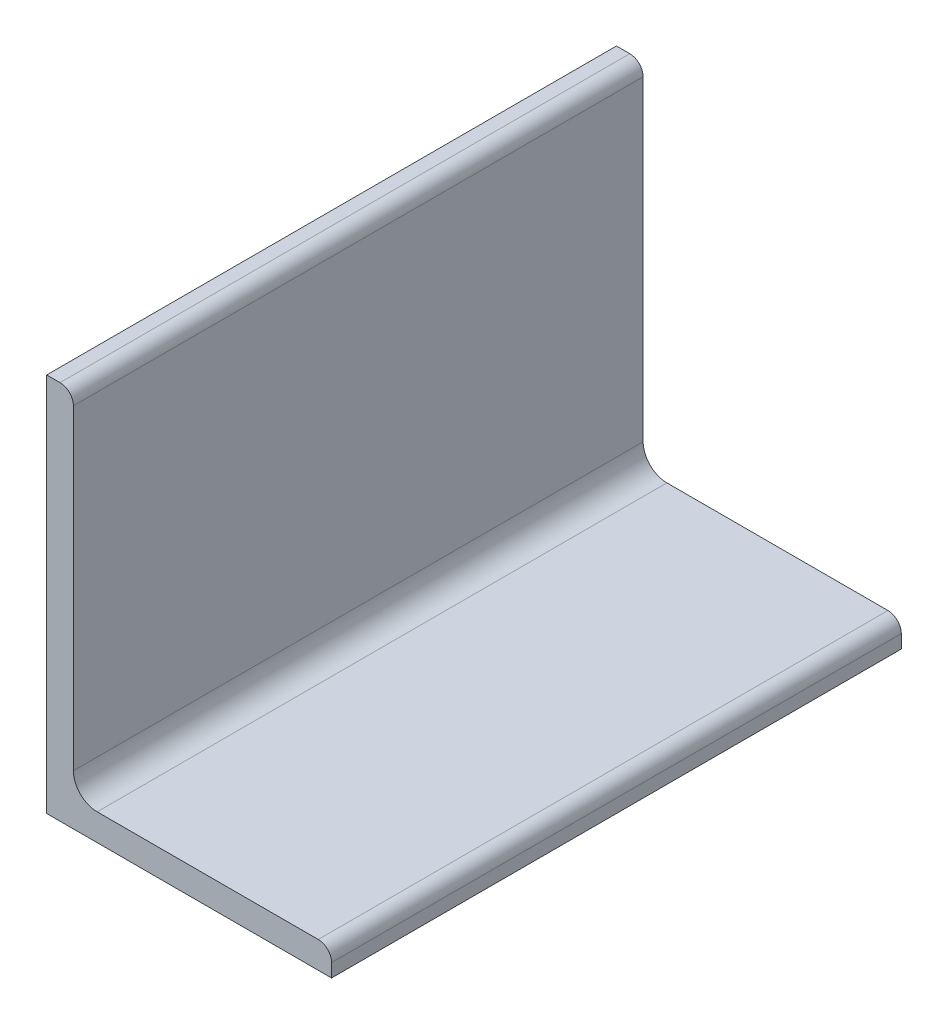
ISO-10303-21;
HEADER;
FILE_DESCRIPTION(('STEP AP214'),'2;1');
FILE_NAME('part.step','',(''),(''),'','','');
FILE_SCHEMA(('AUTOMOTIVE_DESIGN { 1 0 10303 214 1 1 1 1 }'));
ENDSEC;
DATA;
#1=APPLICATION_CONTEXT('core data for automotive mechanical design processes');
#2=APPLICATION_PROTOCOL_DEFINITION('international standard','automotive_design',2000,#1);
#3=PRODUCT_CONTEXT('',#1,'mechanical');
#4=PRODUCT('Part','Part','',(#3));
#5=PRODUCT_RELATED_PRODUCT_CATEGORY('part','',(#4));
#6=PRODUCT_DEFINITION_FORMATION('','',#4);
#7=PRODUCT_DEFINITION_CONTEXT('part definition',#1,'design');
#8=PRODUCT_DEFINITION('design','',#6,#7);
#9=PRODUCT_DEFINITION_SHAPE('','',#8);
#10=(LENGTH_UNIT() NAMED_UNIT(*) SI_UNIT(.MILLI.,.METRE.));
#11=(NAMED_UNIT(*) PLANE_ANGLE_UNIT() SI_UNIT($,.RADIAN.));
#12=(NAMED_UNIT(*) SI_UNIT($,.STERADIAN.) SOLID_ANGLE_UNIT());
#13=UNCERTAINTY_MEASURE_WITH_UNIT(LENGTH_MEASURE(1.E-05),#10,'distance_accuracy_value','');
#14=(GEOMETRIC_REPRESENTATION_CONTEXT(3) GLOBAL_UNCERTAINTY_ASSIGNED_CONTEXT((#13)) GLOBAL_UNIT_ASSIGNED_CONTEXT((#10,
#11,#12)) REPRESENTATION_CONTEXT('',''));
#15=CARTESIAN_POINT('',(0.,0.,0.));
#16=DIRECTION('',(0.,0.,1.));
#17=DIRECTION('',(1.,0.,0.));
#18=AXIS2_PLACEMENT_3D('',#15,#16,#17);
#19=CARTESIAN_POINT('',(0.425014111727251,203.678837479771,304.8));
#20=DIRECTION('',(1.,0.,0.));
#21=DIRECTION('',(0.,0.,-1.));
#22=AXIS2_PLACEMENT_3D('',#19,#20,#21);
#23=PLANE('',#22);
#24=DIRECTION('',(0.,-1.,0.));
#25=VECTOR('',#24,1.);
#26=CARTESIAN_POINT('',(0.425014111727251,203.678837479771,0.));
#27=LINE('',#26,#25);
#28=CARTESIAN_POINT('',(0.425014111727251,203.678837479771,0.));
#29=VERTEX_POINT('',#28);
#30=CARTESIAN_POINT('',(0.425014111727251,0.478837479771347,0.));
#31=VERTEX_POINT('',#30);
#32=EDGE_CURVE('E135',#29,#31,#27,.T.);
#33=ORIENTED_EDGE('',*,*,#32,.T.);
#34=DIRECTION('',(0.,0.,-1.));
#35=VECTOR('',#34,1.);
#36=CARTESIAN_POINT('',(0.425014111727251,0.478837479771347,304.8));
#37=LINE('',#36,#35);
#38=CARTESIAN_POINT('',(0.425014111727251,0.478837479771347,304.8));
#39=VERTEX_POINT('',#38);
#40=EDGE_CURVE('E11',#39,#31,#37,.T.);
#41=ORIENTED_EDGE('',*,*,#40,.F.);
#42=DIRECTION('',(0.,-1.,0.));
#43=VECTOR('',#42,1.);
#44=CARTESIAN_POINT('',(0.425014111727251,203.678837479771,304.8));
#45=LINE('',#44,#43);
#46=CARTESIAN_POINT('',(0.425014111727251,203.678837479771,304.8));
#47=VERTEX_POINT('',#46);
#48=EDGE_CURVE('E151',#47,#39,#45,.T.);
#49=ORIENTED_EDGE('',*,*,#48,.F.);
#50=DIRECTION('',(0.,0.,-1.));
#51=VECTOR('',#50,1.);
#52=CARTESIAN_POINT('',(0.425014111727251,203.678837479771,304.8));
#53=LINE('',#52,#51);
#54=EDGE_CURVE('E131',#47,#29,#53,.T.);
#55=ORIENTED_EDGE('',*,*,#54,.T.);
#56=EDGE_LOOP('',(#33,#41,#49,#55));
#57=FACE_BOUND('',#56,.T.);
#58=ADVANCED_FACE('F33',(#57),#23,.F.);
#59=CARTESIAN_POINT('',(0.425014111727251,0.478837479771347,304.8));
#60=DIRECTION('',(0.,1.,0.));
#61=DIRECTION('',(0.,0.,1.));
#62=AXIS2_PLACEMENT_3D('',#59,#60,#61);
#63=PLANE('',#62);
#64=DIRECTION('',(1.,0.,0.));
#65=VECTOR('',#64,1.);
#66=CARTESIAN_POINT('',(0.425014111727251,0.478837479771347,0.));
#67=LINE('',#66,#65);
#68=CARTESIAN_POINT('',(152.825014111727,0.478837479771347,0.));
#69=VERTEX_POINT('',#68);
#70=EDGE_CURVE('E138',#31,#69,#67,.T.);
#71=ORIENTED_EDGE('',*,*,#70,.T.);
#72=DIRECTION('',(0.,0.,-1.));
#73=VECTOR('',#72,1.);
#74=CARTESIAN_POINT('',(152.825014111727,0.478837479771347,304.8));
#75=LINE('',#74,#73);
#76=CARTESIAN_POINT('',(152.825014111727,0.478837479771347,304.8));
#77=VERTEX_POINT('',#76);
#78=EDGE_CURVE('E41',#77,#69,#75,.T.);
#79=ORIENTED_EDGE('',*,*,#78,.F.);
#80=DIRECTION('',(1.,0.,0.));
#81=VECTOR('',#80,1.);
#82=CARTESIAN_POINT('',(0.425014111727251,0.478837479771347,304.8));
#83=LINE('',#82,#81);
#84=EDGE_CURVE('E95',#39,#77,#83,.T.);
#85=ORIENTED_EDGE('',*,*,#84,.F.);
#86=ORIENTED_EDGE('',*,*,#40,.T.);
#87=EDGE_LOOP('',(#71,#79,#85,#86));
#88=FACE_BOUND('',#87,.T.);
#89=ADVANCED_FACE('F194',(#88),#63,.F.);
#90=CARTESIAN_POINT('',(152.825014111727,0.478837479771347,304.8));
#91=DIRECTION('',(-1.,0.,0.));
#92=DIRECTION('',(0.,0.,1.));
#93=AXIS2_PLACEMENT_3D('',#90,#91,#92);
#94=PLANE('',#93);
#95=DIRECTION('',(0.,1.,0.));
#96=VECTOR('',#95,1.);
#97=CARTESIAN_POINT('',(152.825014111727,0.478837479771347,0.));
#98=LINE('',#97,#96);
#99=CARTESIAN_POINT('',(152.825014111727,7.62258747977135,0.));
#100=VERTEX_POINT('',#99);
#101=EDGE_CURVE('E140',#69,#100,#98,.T.);
#102=ORIENTED_EDGE('',*,*,#101,.T.);
#103=DIRECTION('',(0.,0.,-1.));
#104=VECTOR('',#103,1.);
#105=CARTESIAN_POINT('',(152.825014111727,7.62258747977135,304.8));
#106=LINE('',#105,#104);
#107=CARTESIAN_POINT('',(152.825014111727,7.62258747977135,304.8));
#108=VERTEX_POINT('',#107);
#109=EDGE_CURVE('E161',#108,#100,#106,.T.);
#110=ORIENTED_EDGE('',*,*,#109,.F.);
#111=DIRECTION('',(0.,1.,0.));
#112=VECTOR('',#111,1.);
#113=CARTESIAN_POINT('',(152.825014111727,0.478837479771347,304.8));
#114=LINE('',#113,#112);
#115=EDGE_CURVE('E169',#77,#108,#114,.T.);
#116=ORIENTED_EDGE('',*,*,#115,.F.);
#117=ORIENTED_EDGE('',*,*,#78,.T.);
#118=EDGE_LOOP('',(#102,#110,#116,#117));
#119=FACE_BOUND('',#118,.T.);
#120=ADVANCED_FACE('F167',(#119),#94,.F.);
#121=CARTESIAN_POINT('',(145.681264111727,7.62258747977135,304.8));
#122=DIRECTION('',(0.,0.,-1.));
#123=DIRECTION('',(-1.,0.,0.));
#124=AXIS2_PLACEMENT_3D('',#121,#122,#123);
#125=CYLINDRICAL_SURFACE('',#124,7.14375);
#126=CARTESIAN_POINT('',(145.681264111727,7.62258747977135,0.));
#127=DIRECTION('',(0.,0.,1.));
#128=DIRECTION('',(1.,0.,0.));
#129=AXIS2_PLACEMENT_3D('',#126,#127,#128);
#130=CIRCLE('',#129,7.14375);
#131=CARTESIAN_POINT('',(145.681264111727,14.7663374797713,0.));
#132=VERTEX_POINT('',#131);
#133=EDGE_CURVE('E142',#100,#132,#130,.T.);
#134=ORIENTED_EDGE('',*,*,#133,.T.);
#135=DIRECTION('',(0.,0.,-1.));
#136=VECTOR('',#135,1.);
#137=CARTESIAN_POINT('',(145.681264111727,14.7663374797713,304.8));
#138=LINE('',#137,#136);
#139=CARTESIAN_POINT('',(145.681264111727,14.7663374797713,304.8));
#140=VERTEX_POINT('',#139);
#141=EDGE_CURVE('E158',#140,#132,#138,.T.);
#142=ORIENTED_EDGE('',*,*,#141,.F.);
#143=CARTESIAN_POINT('',(145.681264111727,7.62258747977135,304.8));
#144=DIRECTION('',(0.,0.,1.));
#145=DIRECTION('',(1.,0.,0.));
#146=AXIS2_PLACEMENT_3D('',#143,#144,#145);
#147=CIRCLE('',#146,7.14375);
#148=EDGE_CURVE('E185',#108,#140,#147,.T.);
#149=ORIENTED_EDGE('',*,*,#148,.F.);
#150=ORIENTED_EDGE('',*,*,#109,.T.);
#151=EDGE_LOOP('',(#134,#142,#149,#150));
#152=FACE_BOUND('',#151,.T.);
#153=ADVANCED_FACE('F178',(#152),#125,.T.);
#154=CARTESIAN_POINT('',(145.681264111727,14.7663374797713,304.8));
#155=DIRECTION('',(0.,-1.,0.));
#156=DIRECTION('',(0.,0.,-1.));
#157=AXIS2_PLACEMENT_3D('',#154,#155,#156);
#158=PLANE('',#157);
#159=DIRECTION('',(-1.,0.,0.));
#160=VECTOR('',#159,1.);
#161=CARTESIAN_POINT('',(145.681264111727,14.7663374797713,0.));
#162=LINE('',#161,#160);
#163=CARTESIAN_POINT('',(27.4125141117273,14.7663374797713,0.));
#164=VERTEX_POINT('',#163);
#165=EDGE_CURVE('E144',#132,#164,#162,.T.);
#166=ORIENTED_EDGE('',*,*,#165,.T.);
#167=DIRECTION('',(0.,0.,-1.));
#168=VECTOR('',#167,1.);
#169=CARTESIAN_POINT('',(27.4125141117273,14.7663374797713,304.8));
#170=LINE('',#169,#168);
#171=CARTESIAN_POINT('',(27.4125141117273,14.7663374797713,304.8));
#172=VERTEX_POINT('',#171);
#173=EDGE_CURVE('E155',#172,#164,#170,.T.);
#174=ORIENTED_EDGE('',*,*,#173,.F.);
#175=DIRECTION('',(-1.,0.,0.));
#176=VECTOR('',#175,1.);
#177=CARTESIAN_POINT('',(145.681264111727,14.7663374797713,304.8));
#178=LINE('',#177,#176);
#179=EDGE_CURVE('E184',#140,#172,#178,.T.);
#180=ORIENTED_EDGE('',*,*,#179,.F.);
#181=ORIENTED_EDGE('',*,*,#141,.T.);
#182=EDGE_LOOP('',(#166,#174,#180,#181));
#183=FACE_BOUND('',#182,.T.);
#184=ADVANCED_FACE('F182',(#183),#158,.F.);
#185=CARTESIAN_POINT('',(27.4125141117272,27.4663374797713,304.8));
#186=DIRECTION('',(0.,0.,-1.));
#187=DIRECTION('',(-1.,0.,0.));
#188=AXIS2_PLACEMENT_3D('',#185,#186,#187);
#189=CYLINDRICAL_SURFACE('',#188,12.7);
#190=CARTESIAN_POINT('',(27.4125141117272,27.4663374797713,0.));
#191=DIRECTION('',(0.,0.,-1.));
#192=DIRECTION('',(1.,0.,0.));
#193=AXIS2_PLACEMENT_3D('',#190,#191,#192);
#194=CIRCLE('',#193,12.7);
#195=CARTESIAN_POINT('',(14.7125141117273,27.4663374797713,0.));
#196=VERTEX_POINT('',#195);
#197=EDGE_CURVE('E146',#164,#196,#194,.T.);
#198=ORIENTED_EDGE('',*,*,#197,.T.);
#199=DIRECTION('',(0.,0.,-1.));
#200=VECTOR('',#199,1.);
#201=CARTESIAN_POINT('',(14.7125141117273,27.4663374797713,304.8));
#202=LINE('',#201,#200);
#203=CARTESIAN_POINT('',(14.7125141117273,27.4663374797713,304.8));
#204=VERTEX_POINT('',#203);
#205=EDGE_CURVE('E126',#204,#196,#202,.T.);
#206=ORIENTED_EDGE('',*,*,#205,.F.);
#207=CARTESIAN_POINT('',(27.4125141117272,27.4663374797713,304.8));
#208=DIRECTION('',(0.,0.,-1.));
#209=DIRECTION('',(1.,0.,0.));
#210=AXIS2_PLACEMENT_3D('',#207,#208,#209);
#211=CIRCLE('',#210,12.7);
#212=EDGE_CURVE('E117',#172,#204,#211,.T.);
#213=ORIENTED_EDGE('',*,*,#212,.F.);
#214=ORIENTED_EDGE('',*,*,#173,.T.);
#215=EDGE_LOOP('',(#198,#206,#213,#214));
#216=FACE_BOUND('',#215,.T.);
#217=ADVANCED_FACE('F206',(#216),#189,.F.);
#218=CARTESIAN_POINT('',(14.7125141117273,27.4663374797713,304.8));
#219=DIRECTION('',(-1.,0.,0.));
#220=DIRECTION('',(0.,0.,1.));
#221=AXIS2_PLACEMENT_3D('',#218,#219,#220);
#222=PLANE('',#221);
#223=DIRECTION('',(0.,1.,0.));
#224=VECTOR('',#223,1.);
#225=CARTESIAN_POINT('',(14.7125141117273,27.4663374797713,0.));
#226=LINE('',#225,#224);
#227=CARTESIAN_POINT('',(14.7125141117273,196.535087479771,0.));
#228=VERTEX_POINT('',#227);
#229=EDGE_CURVE('E125',#196,#228,#226,.T.);
#230=ORIENTED_EDGE('',*,*,#229,.T.);
#231=DIRECTION('',(0.,0.,-1.));
#232=VECTOR('',#231,1.);
#233=CARTESIAN_POINT('',(14.7125141117273,196.535087479771,304.8));
#234=LINE('',#233,#232);
#235=CARTESIAN_POINT('',(14.7125141117273,196.535087479771,304.8));
#236=VERTEX_POINT('',#235);
#237=EDGE_CURVE('E122',#236,#228,#234,.T.);
#238=ORIENTED_EDGE('',*,*,#237,.F.);
#239=DIRECTION('',(0.,1.,0.));
#240=VECTOR('',#239,1.);
#241=CARTESIAN_POINT('',(14.7125141117273,27.4663374797713,304.8));
#242=LINE('',#241,#240);
#243=EDGE_CURVE('E111',#204,#236,#242,.T.);
#244=ORIENTED_EDGE('',*,*,#243,.F.);
#245=ORIENTED_EDGE('',*,*,#205,.T.);
#246=EDGE_LOOP('',(#230,#238,#244,#245));
#247=FACE_BOUND('',#246,.T.);
#248=ADVANCED_FACE('F123',(#247),#222,.F.);
#249=CARTESIAN_POINT('',(7.56876411172724,196.535087479771,304.8));
#250=DIRECTION('',(0.,0.,-1.));
#251=DIRECTION('',(-1.,0.,0.));
#252=AXIS2_PLACEMENT_3D('',#249,#250,#251);
#253=CYLINDRICAL_SURFACE('',#252,7.14375000000001);
#254=CARTESIAN_POINT('',(7.56876411172724,196.535087479771,0.));
#255=DIRECTION('',(0.,0.,1.));
#256=DIRECTION('',(1.,0.,0.));
#257=AXIS2_PLACEMENT_3D('',#254,#255,#256);
#258=CIRCLE('',#257,7.14375000000001);
#259=CARTESIAN_POINT('',(7.56876411172725,203.678837479771,0.));
#260=VERTEX_POINT('',#259);
#261=EDGE_CURVE('E81',#228,#260,#258,.T.);
#262=ORIENTED_EDGE('',*,*,#261,.T.);
#263=DIRECTION('',(0.,0.,-1.));
#264=VECTOR('',#263,1.);
#265=CARTESIAN_POINT('',(7.56876411172725,203.678837479771,304.8));
#266=LINE('',#265,#264);
#267=CARTESIAN_POINT('',(7.56876411172725,203.678837479771,304.8));
#268=VERTEX_POINT('',#267);
#269=EDGE_CURVE('E127',#268,#260,#266,.T.);
#270=ORIENTED_EDGE('',*,*,#269,.F.);
#271=CARTESIAN_POINT('',(7.56876411172724,196.535087479771,304.8));
#272=DIRECTION('',(0.,0.,1.));
#273=DIRECTION('',(1.,0.,0.));
#274=AXIS2_PLACEMENT_3D('',#271,#272,#273);
#275=CIRCLE('',#274,7.14375000000001);
#276=EDGE_CURVE('E115',#236,#268,#275,.T.);
#277=ORIENTED_EDGE('',*,*,#276,.F.);
#278=ORIENTED_EDGE('',*,*,#237,.T.);
#279=EDGE_LOOP('',(#262,#270,#277,#278));
#280=FACE_BOUND('',#279,.T.);
#281=ADVANCED_FACE('F129',(#280),#253,.T.);
#282=CARTESIAN_POINT('',(7.56876411172725,203.678837479771,304.8));
#283=DIRECTION('',(0.,-1.,0.));
#284=DIRECTION('',(0.,0.,-1.));
#285=AXIS2_PLACEMENT_3D('',#282,#283,#284);
#286=PLANE('',#285);
#287=DIRECTION('',(-1.,0.,0.));
#288=VECTOR('',#287,1.);
#289=CARTESIAN_POINT('',(7.56876411172725,203.678837479771,0.));
#290=LINE('',#289,#288);
#291=EDGE_CURVE('E87',#260,#29,#290,.T.);
#292=ORIENTED_EDGE('',*,*,#291,.T.);
#293=ORIENTED_EDGE('',*,*,#54,.F.);
#294=DIRECTION('',(-1.,0.,0.));
#295=VECTOR('',#294,1.);
#296=CARTESIAN_POINT('',(7.56876411172725,203.678837479771,304.8));
#297=LINE('',#296,#295);
#298=EDGE_CURVE('E49',#268,#47,#297,.T.);
#299=ORIENTED_EDGE('',*,*,#298,.F.);
#300=ORIENTED_EDGE('',*,*,#269,.T.);
#301=EDGE_LOOP('',(#292,#293,#299,#300));
#302=FACE_BOUND('',#301,.T.);
#303=ADVANCED_FACE('F214',(#302),#286,.F.);
#304=CARTESIAN_POINT('',(145.681264111727,7.62258747977135,304.8));
#305=DIRECTION('',(0.,0.,1.));
#306=DIRECTION('',(1.,0.,0.));
#307=AXIS2_PLACEMENT_3D('',#304,#305,#306);
#308=PLANE('',#307);
#309=ORIENTED_EDGE('',*,*,#48,.T.);
#310=ORIENTED_EDGE('',*,*,#84,.T.);
#311=ORIENTED_EDGE('',*,*,#115,.T.);
#312=ORIENTED_EDGE('',*,*,#148,.T.);
#313=ORIENTED_EDGE('',*,*,#179,.T.);
#314=ORIENTED_EDGE('',*,*,#212,.T.);
#315=ORIENTED_EDGE('',*,*,#243,.T.);
#316=ORIENTED_EDGE('',*,*,#276,.T.);
#317=ORIENTED_EDGE('',*,*,#298,.T.);
#318=EDGE_LOOP('',(#309,#310,#311,#312,#313,#314,#315,#316,#317));
#319=FACE_BOUND('',#318,.T.);
#320=ADVANCED_FACE('F113',(#319),#308,.T.);
#321=CARTESIAN_POINT('',(145.681264111727,7.62258747977135,0.));
#322=DIRECTION('',(0.,0.,1.));
#323=DIRECTION('',(1.,0.,0.));
#324=AXIS2_PLACEMENT_3D('',#321,#322,#323);
#325=PLANE('',#324);
#326=ORIENTED_EDGE('',*,*,#32,.F.);
#327=ORIENTED_EDGE('',*,*,#291,.F.);
#328=ORIENTED_EDGE('',*,*,#261,.F.);
#329=ORIENTED_EDGE('',*,*,#229,.F.);
#330=ORIENTED_EDGE('',*,*,#197,.F.);
#331=ORIENTED_EDGE('',*,*,#165,.F.);
#332=ORIENTED_EDGE('',*,*,#133,.F.);
#333=ORIENTED_EDGE('',*,*,#101,.F.);
#334=ORIENTED_EDGE('',*,*,#70,.F.);
#335=EDGE_LOOP('',(#326,#327,#328,#329,#330,#331,#332,#333,#334));
#336=FACE_BOUND('',#335,.T.);
#337=ADVANCED_FACE('F173',(#336),#325,.F.);
#338=CLOSED_SHELL('',(#58,#89,#120,#153,#184,#217,#248,#281,#303,#320,#337));
#339=MANIFOLD_SOLID_BREP('B2',#338);
#340=ADVANCED_BREP_SHAPE_REPRESENTATION('',(#18,#339),#14);
#341=SHAPE_DEFINITION_REPRESENTATION(#9,#340);
ENDSEC;
END-ISO-10303-21;
